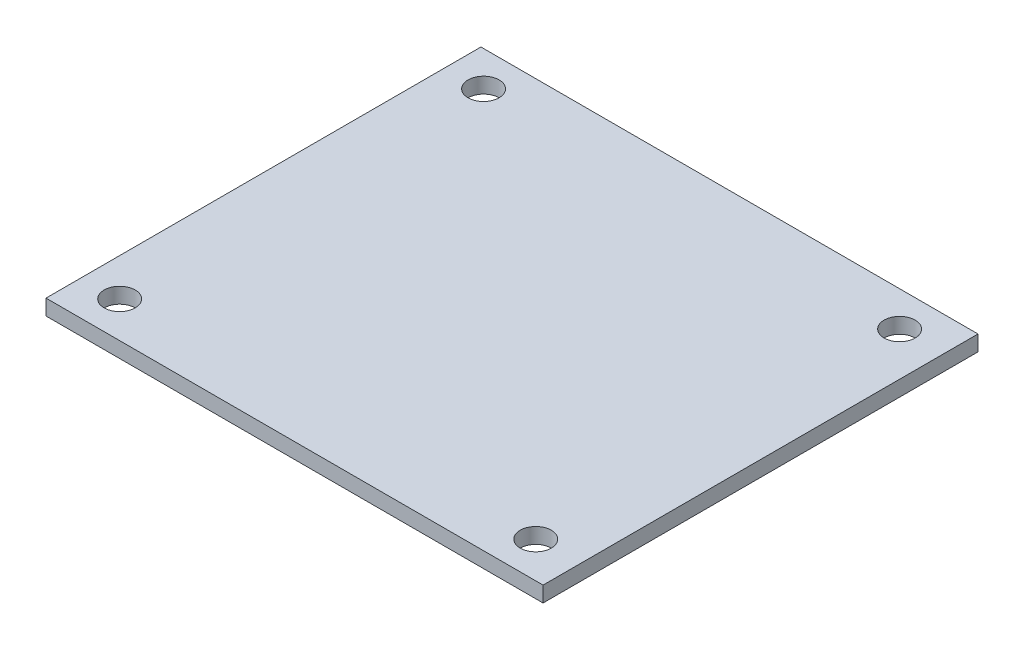
ISO-10303-21;
HEADER;
FILE_DESCRIPTION(('STEP AP214'),'2;1');
FILE_NAME('part.step','',(''),(''),'','','');
FILE_SCHEMA(('AUTOMOTIVE_DESIGN { 1 0 10303 214 1 1 1 1 }'));
ENDSEC;
DATA;
#1=APPLICATION_CONTEXT('core data for automotive mechanical design processes');
#2=APPLICATION_PROTOCOL_DEFINITION('international standard','automotive_design',2000,#1);
#3=PRODUCT_CONTEXT('',#1,'mechanical');
#4=PRODUCT('Part','Part','',(#3));
#5=PRODUCT_RELATED_PRODUCT_CATEGORY('part','',(#4));
#6=PRODUCT_DEFINITION_FORMATION('','',#4);
#7=PRODUCT_DEFINITION_CONTEXT('part definition',#1,'design');
#8=PRODUCT_DEFINITION('design','',#6,#7);
#9=PRODUCT_DEFINITION_SHAPE('','',#8);
#10=(LENGTH_UNIT() NAMED_UNIT(*) SI_UNIT(.MILLI.,.METRE.));
#11=(NAMED_UNIT(*) PLANE_ANGLE_UNIT() SI_UNIT($,.RADIAN.));
#12=(NAMED_UNIT(*) SI_UNIT($,.STERADIAN.) SOLID_ANGLE_UNIT());
#13=UNCERTAINTY_MEASURE_WITH_UNIT(LENGTH_MEASURE(1.E-05),#10,'distance_accuracy_value','');
#14=(GEOMETRIC_REPRESENTATION_CONTEXT(3) GLOBAL_UNCERTAINTY_ASSIGNED_CONTEXT((#13)) GLOBAL_UNIT_ASSIGNED_CONTEXT((#10,
#11,#12)) REPRESENTATION_CONTEXT('',''));
#15=CARTESIAN_POINT('',(0.,0.,0.));
#16=DIRECTION('',(0.,0.,1.));
#17=DIRECTION('',(1.,0.,0.));
#18=AXIS2_PLACEMENT_3D('',#15,#16,#17);
#19=CARTESIAN_POINT('',(24.,1.5,-21.));
#20=DIRECTION('',(-1.,0.,0.));
#21=DIRECTION('',(0.,0.,1.));
#22=AXIS2_PLACEMENT_3D('',#19,#20,#21);
#23=PLANE('',#22);
#24=DIRECTION('',(0.,0.,-1.));
#25=VECTOR('',#24,1.);
#26=CARTESIAN_POINT('',(24.,0.,-21.));
#27=LINE('',#26,#25);
#28=CARTESIAN_POINT('',(24.,0.,21.));
#29=VERTEX_POINT('',#28);
#30=CARTESIAN_POINT('',(24.,0.,-21.));
#31=VERTEX_POINT('',#30);
#32=EDGE_CURVE('E98',#29,#31,#27,.T.);
#33=ORIENTED_EDGE('',*,*,#32,.T.);
#34=DIRECTION('',(0.,-1.,0.));
#35=VECTOR('',#34,1.);
#36=CARTESIAN_POINT('',(24.,1.5,-21.));
#37=LINE('',#36,#35);
#38=CARTESIAN_POINT('',(24.,1.5,-21.));
#39=VERTEX_POINT('',#38);
#40=EDGE_CURVE('E11',#39,#31,#37,.T.);
#41=ORIENTED_EDGE('',*,*,#40,.F.);
#42=DIRECTION('',(0.,0.,-1.));
#43=VECTOR('',#42,1.);
#44=CARTESIAN_POINT('',(24.,1.5,-21.));
#45=LINE('',#44,#43);
#46=CARTESIAN_POINT('',(24.,1.5,21.));
#47=VERTEX_POINT('',#46);
#48=EDGE_CURVE('E86',#47,#39,#45,.T.);
#49=ORIENTED_EDGE('',*,*,#48,.F.);
#50=DIRECTION('',(0.,-1.,0.));
#51=VECTOR('',#50,1.);
#52=CARTESIAN_POINT('',(24.,1.5,21.));
#53=LINE('',#52,#51);
#54=EDGE_CURVE('E94',#47,#29,#53,.T.);
#55=ORIENTED_EDGE('',*,*,#54,.T.);
#56=EDGE_LOOP('',(#33,#41,#49,#55));
#57=FACE_BOUND('',#56,.T.);
#58=ADVANCED_FACE('F35',(#57),#23,.F.);
#59=CARTESIAN_POINT('',(-24.,1.5,-21.));
#60=DIRECTION('',(0.,0.,1.));
#61=DIRECTION('',(1.,0.,0.));
#62=AXIS2_PLACEMENT_3D('',#59,#60,#61);
#63=PLANE('',#62);
#64=DIRECTION('',(-1.,0.,0.));
#65=VECTOR('',#64,1.);
#66=CARTESIAN_POINT('',(-24.,0.,-21.));
#67=LINE('',#66,#65);
#68=CARTESIAN_POINT('',(-24.,0.,-21.));
#69=VERTEX_POINT('',#68);
#70=EDGE_CURVE('E90',#31,#69,#67,.T.);
#71=ORIENTED_EDGE('',*,*,#70,.T.);
#72=DIRECTION('',(0.,-1.,0.));
#73=VECTOR('',#72,1.);
#74=CARTESIAN_POINT('',(-24.,1.5,-21.));
#75=LINE('',#74,#73);
#76=CARTESIAN_POINT('',(-24.,1.5,-21.));
#77=VERTEX_POINT('',#76);
#78=EDGE_CURVE('E43',#77,#69,#75,.T.);
#79=ORIENTED_EDGE('',*,*,#78,.F.);
#80=DIRECTION('',(-1.,0.,0.));
#81=VECTOR('',#80,1.);
#82=CARTESIAN_POINT('',(-24.,1.5,-21.));
#83=LINE('',#82,#81);
#84=EDGE_CURVE('E81',#39,#77,#83,.T.);
#85=ORIENTED_EDGE('',*,*,#84,.F.);
#86=ORIENTED_EDGE('',*,*,#40,.T.);
#87=EDGE_LOOP('',(#71,#79,#85,#86));
#88=FACE_BOUND('',#87,.T.);
#89=ADVANCED_FACE('F89',(#88),#63,.F.);
#90=CARTESIAN_POINT('',(-24.,1.5,-21.));
#91=DIRECTION('',(1.,0.,0.));
#92=DIRECTION('',(0.,0.,-1.));
#93=AXIS2_PLACEMENT_3D('',#90,#91,#92);
#94=PLANE('',#93);
#95=DIRECTION('',(0.,0.,1.));
#96=VECTOR('',#95,1.);
#97=CARTESIAN_POINT('',(-24.,0.,-21.));
#98=LINE('',#97,#96);
#99=CARTESIAN_POINT('',(-24.,0.,21.));
#100=VERTEX_POINT('',#99);
#101=EDGE_CURVE('E68',#69,#100,#98,.T.);
#102=ORIENTED_EDGE('',*,*,#101,.T.);
#103=DIRECTION('',(0.,-1.,0.));
#104=VECTOR('',#103,1.);
#105=CARTESIAN_POINT('',(-24.,1.5,21.));
#106=LINE('',#105,#104);
#107=CARTESIAN_POINT('',(-24.,1.5,21.));
#108=VERTEX_POINT('',#107);
#109=EDGE_CURVE('E91',#108,#100,#106,.T.);
#110=ORIENTED_EDGE('',*,*,#109,.F.);
#111=DIRECTION('',(0.,0.,1.));
#112=VECTOR('',#111,1.);
#113=CARTESIAN_POINT('',(-24.,1.5,-21.));
#114=LINE('',#113,#112);
#115=EDGE_CURVE('E84',#77,#108,#114,.T.);
#116=ORIENTED_EDGE('',*,*,#115,.F.);
#117=ORIENTED_EDGE('',*,*,#78,.T.);
#118=EDGE_LOOP('',(#102,#110,#116,#117));
#119=FACE_BOUND('',#118,.T.);
#120=ADVANCED_FACE('F92',(#119),#94,.F.);
#121=CARTESIAN_POINT('',(-24.,1.5,21.));
#122=DIRECTION('',(0.,0.,-1.));
#123=DIRECTION('',(-1.,0.,0.));
#124=AXIS2_PLACEMENT_3D('',#121,#122,#123);
#125=PLANE('',#124);
#126=DIRECTION('',(1.,0.,0.));
#127=VECTOR('',#126,1.);
#128=CARTESIAN_POINT('',(-24.,0.,21.));
#129=LINE('',#128,#127);
#130=EDGE_CURVE('E74',#100,#29,#129,.T.);
#131=ORIENTED_EDGE('',*,*,#130,.T.);
#132=ORIENTED_EDGE('',*,*,#54,.F.);
#133=DIRECTION('',(1.,0.,0.));
#134=VECTOR('',#133,1.);
#135=CARTESIAN_POINT('',(-24.,1.5,21.));
#136=LINE('',#135,#134);
#137=EDGE_CURVE('E51',#108,#47,#136,.T.);
#138=ORIENTED_EDGE('',*,*,#137,.F.);
#139=ORIENTED_EDGE('',*,*,#109,.T.);
#140=EDGE_LOOP('',(#131,#132,#138,#139));
#141=FACE_BOUND('',#140,.T.);
#142=ADVANCED_FACE('F106',(#141),#125,.F.);
#143=CARTESIAN_POINT('',(0.,1.5,0.));
#144=DIRECTION('',(0.,1.,0.));
#145=DIRECTION('',(0.,0.,1.));
#146=AXIS2_PLACEMENT_3D('',#143,#144,#145);
#147=PLANE('',#146);
#148=CARTESIAN_POINT('',(-20.3717056756248,1.5,17.5140080739052));
#149=DIRECTION('',(0.,1.,0.));
#150=DIRECTION('',(0.,0.,1.));
#151=AXIS2_PLACEMENT_3D('',#148,#149,#150);
#152=CIRCLE('',#151,1.5);
#153=CARTESIAN_POINT('',(-20.3717056756248,1.5,19.0140080739052));
#154=VERTEX_POINT('',#153);
#155=EDGE_CURVE('E130',#154,#154,#152,.T.);
#156=ORIENTED_EDGE('',*,*,#155,.F.);
#157=EDGE_LOOP('',(#156));
#158=FACE_BOUND('',#157,.T.);
#159=CARTESIAN_POINT('',(19.805824962413,1.5,17.5140080739052));
#160=DIRECTION('',(0.,1.,0.));
#161=DIRECTION('',(0.,0.,1.));
#162=AXIS2_PLACEMENT_3D('',#159,#160,#161);
#163=CIRCLE('',#162,1.5);
#164=CARTESIAN_POINT('',(19.805824962413,1.5,19.0140080739052));
#165=VERTEX_POINT('',#164);
#166=EDGE_CURVE('E124',#165,#165,#163,.T.);
#167=ORIENTED_EDGE('',*,*,#166,.F.);
#168=EDGE_LOOP('',(#167));
#169=FACE_BOUND('',#168,.T.);
#170=CARTESIAN_POINT('',(19.805824962413,1.5,-17.6271842165475));
#171=DIRECTION('',(0.,1.,0.));
#172=DIRECTION('',(0.,0.,1.));
#173=AXIS2_PLACEMENT_3D('',#170,#171,#172);
#174=CIRCLE('',#173,1.5);
#175=CARTESIAN_POINT('',(19.805824962413,1.5,-16.1271842165475));
#176=VERTEX_POINT('',#175);
#177=EDGE_CURVE('E118',#176,#176,#174,.T.);
#178=ORIENTED_EDGE('',*,*,#177,.F.);
#179=EDGE_LOOP('',(#178));
#180=FACE_BOUND('',#179,.T.);
#181=CARTESIAN_POINT('',(-20.3717056756248,1.5,-17.6271842165475));
#182=DIRECTION('',(0.,1.,0.));
#183=DIRECTION('',(0.,0.,1.));
#184=AXIS2_PLACEMENT_3D('',#181,#182,#183);
#185=CIRCLE('',#184,1.5);
#186=CARTESIAN_POINT('',(-20.3717056756248,1.5,-16.1271842165475));
#187=VERTEX_POINT('',#186);
#188=EDGE_CURVE('E112',#187,#187,#185,.T.);
#189=ORIENTED_EDGE('',*,*,#188,.F.);
#190=EDGE_LOOP('',(#189));
#191=FACE_BOUND('',#190,.T.);
#192=ORIENTED_EDGE('',*,*,#48,.T.);
#193=ORIENTED_EDGE('',*,*,#84,.T.);
#194=ORIENTED_EDGE('',*,*,#115,.T.);
#195=ORIENTED_EDGE('',*,*,#137,.T.);
#196=EDGE_LOOP('',(#192,#193,#194,#195));
#197=FACE_BOUND('',#196,.T.);
#198=ADVANCED_FACE('F82',(#158,#169,#180,#191,#197),#147,.T.);
#199=CARTESIAN_POINT('',(0.,0.,0.));
#200=DIRECTION('',(0.,1.,0.));
#201=DIRECTION('',(0.,0.,1.));
#202=AXIS2_PLACEMENT_3D('',#199,#200,#201);
#203=PLANE('',#202);
#204=CARTESIAN_POINT('',(-20.3717056756248,0.,17.5140080739052));
#205=DIRECTION('',(0.,1.,0.));
#206=DIRECTION('',(0.,0.,1.));
#207=AXIS2_PLACEMENT_3D('',#204,#205,#206);
#208=CIRCLE('',#207,1.5);
#209=CARTESIAN_POINT('',(-20.3717056756248,0.,19.0140080739052));
#210=VERTEX_POINT('',#209);
#211=EDGE_CURVE('E127',#210,#210,#208,.T.);
#212=ORIENTED_EDGE('',*,*,#211,.T.);
#213=EDGE_LOOP('',(#212));
#214=FACE_BOUND('',#213,.T.);
#215=CARTESIAN_POINT('',(19.805824962413,0.,17.5140080739052));
#216=DIRECTION('',(0.,1.,0.));
#217=DIRECTION('',(0.,0.,1.));
#218=AXIS2_PLACEMENT_3D('',#215,#216,#217);
#219=CIRCLE('',#218,1.5);
#220=CARTESIAN_POINT('',(19.805824962413,0.,19.0140080739052));
#221=VERTEX_POINT('',#220);
#222=EDGE_CURVE('E121',#221,#221,#219,.T.);
#223=ORIENTED_EDGE('',*,*,#222,.T.);
#224=EDGE_LOOP('',(#223));
#225=FACE_BOUND('',#224,.T.);
#226=CARTESIAN_POINT('',(19.805824962413,0.,-17.6271842165475));
#227=DIRECTION('',(0.,1.,0.));
#228=DIRECTION('',(0.,0.,1.));
#229=AXIS2_PLACEMENT_3D('',#226,#227,#228);
#230=CIRCLE('',#229,1.5);
#231=CARTESIAN_POINT('',(19.805824962413,0.,-16.1271842165475));
#232=VERTEX_POINT('',#231);
#233=EDGE_CURVE('E115',#232,#232,#230,.T.);
#234=ORIENTED_EDGE('',*,*,#233,.T.);
#235=EDGE_LOOP('',(#234));
#236=FACE_BOUND('',#235,.T.);
#237=CARTESIAN_POINT('',(-20.3717056756248,0.,-17.6271842165475));
#238=DIRECTION('',(0.,1.,0.));
#239=DIRECTION('',(0.,0.,1.));
#240=AXIS2_PLACEMENT_3D('',#237,#238,#239);
#241=CIRCLE('',#240,1.5);
#242=CARTESIAN_POINT('',(-20.3717056756248,0.,-16.1271842165475));
#243=VERTEX_POINT('',#242);
#244=EDGE_CURVE('E101',#243,#243,#241,.T.);
#245=ORIENTED_EDGE('',*,*,#244,.T.);
#246=EDGE_LOOP('',(#245));
#247=FACE_BOUND('',#246,.T.);
#248=ORIENTED_EDGE('',*,*,#32,.F.);
#249=ORIENTED_EDGE('',*,*,#130,.F.);
#250=ORIENTED_EDGE('',*,*,#101,.F.);
#251=ORIENTED_EDGE('',*,*,#70,.F.);
#252=EDGE_LOOP('',(#248,#249,#250,#251));
#253=FACE_BOUND('',#252,.T.);
#254=ADVANCED_FACE('F109',(#214,#225,#236,#247,#253),#203,.F.);
#255=CARTESIAN_POINT('',(-20.3717056756248,0.,-17.6271842165475));
#256=DIRECTION('',(0.,1.,0.));
#257=DIRECTION('',(0.,0.,1.));
#258=AXIS2_PLACEMENT_3D('',#255,#256,#257);
#259=CYLINDRICAL_SURFACE('',#258,1.5);
#260=ORIENTED_EDGE('',*,*,#244,.F.);
#261=EDGE_LOOP('',(#260));
#262=FACE_BOUND('',#261,.T.);
#263=ORIENTED_EDGE('',*,*,#188,.T.);
#264=EDGE_LOOP('',(#263));
#265=FACE_BOUND('',#264,.T.);
#266=ADVANCED_FACE('F154',(#262,#265),#259,.F.);
#267=CARTESIAN_POINT('',(19.805824962413,0.,-17.6271842165475));
#268=DIRECTION('',(0.,1.,0.));
#269=DIRECTION('',(0.,0.,1.));
#270=AXIS2_PLACEMENT_3D('',#267,#268,#269);
#271=CYLINDRICAL_SURFACE('',#270,1.5);
#272=ORIENTED_EDGE('',*,*,#233,.F.);
#273=EDGE_LOOP('',(#272));
#274=FACE_BOUND('',#273,.T.);
#275=ORIENTED_EDGE('',*,*,#177,.T.);
#276=EDGE_LOOP('',(#275));
#277=FACE_BOUND('',#276,.T.);
#278=ADVANCED_FACE('F156',(#274,#277),#271,.F.);
#279=CARTESIAN_POINT('',(19.805824962413,0.,17.5140080739052));
#280=DIRECTION('',(0.,1.,0.));
#281=DIRECTION('',(0.,0.,1.));
#282=AXIS2_PLACEMENT_3D('',#279,#280,#281);
#283=CYLINDRICAL_SURFACE('',#282,1.5);
#284=ORIENTED_EDGE('',*,*,#222,.F.);
#285=EDGE_LOOP('',(#284));
#286=FACE_BOUND('',#285,.T.);
#287=ORIENTED_EDGE('',*,*,#166,.T.);
#288=EDGE_LOOP('',(#287));
#289=FACE_BOUND('',#288,.T.);
#290=ADVANCED_FACE('F141',(#286,#289),#283,.F.);
#291=CARTESIAN_POINT('',(-20.3717056756248,0.,17.5140080739052));
#292=DIRECTION('',(0.,1.,0.));
#293=DIRECTION('',(0.,0.,1.));
#294=AXIS2_PLACEMENT_3D('',#291,#292,#293);
#295=CYLINDRICAL_SURFACE('',#294,1.5);
#296=ORIENTED_EDGE('',*,*,#211,.F.);
#297=EDGE_LOOP('',(#296));
#298=FACE_BOUND('',#297,.T.);
#299=ORIENTED_EDGE('',*,*,#155,.T.);
#300=EDGE_LOOP('',(#299));
#301=FACE_BOUND('',#300,.T.);
#302=ADVANCED_FACE('F138',(#298,#301),#295,.F.);
#303=CLOSED_SHELL('',(#58,#89,#120,#142,#198,#254,#266,#278,#290,#302));
#304=MANIFOLD_SOLID_BREP('B2',#303);
#305=ADVANCED_BREP_SHAPE_REPRESENTATION('',(#18,#304),#14);
#306=SHAPE_DEFINITION_REPRESENTATION(#9,#305);
ENDSEC;
END-ISO-10303-21;
